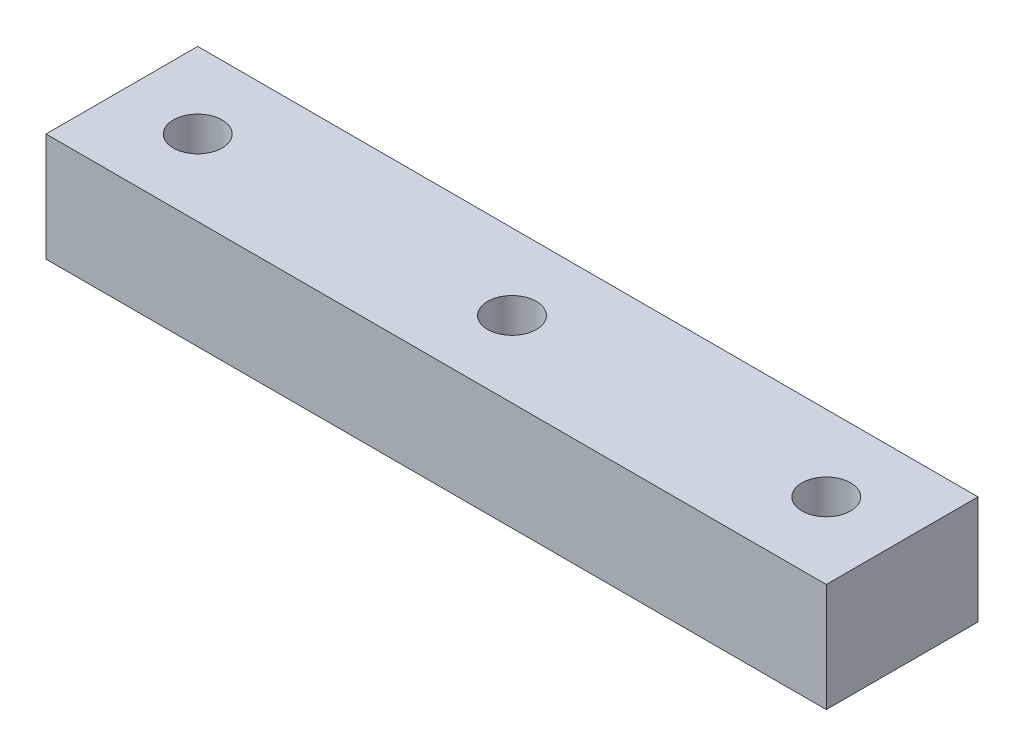
ISO-10303-21;
HEADER;
FILE_DESCRIPTION(('STEP AP214'),'2;1');
FILE_NAME('part.step','',(''),(''),'','','');
FILE_SCHEMA(('AUTOMOTIVE_DESIGN { 1 0 10303 214 1 1 1 1 }'));
ENDSEC;
DATA;
#1=APPLICATION_CONTEXT('core data for automotive mechanical design processes');
#2=APPLICATION_PROTOCOL_DEFINITION('international standard','automotive_design',2000,#1);
#3=PRODUCT_CONTEXT('',#1,'mechanical');
#4=PRODUCT('Part','Part','',(#3));
#5=PRODUCT_RELATED_PRODUCT_CATEGORY('part','',(#4));
#6=PRODUCT_DEFINITION_FORMATION('','',#4);
#7=PRODUCT_DEFINITION_CONTEXT('part definition',#1,'design');
#8=PRODUCT_DEFINITION('design','',#6,#7);
#9=PRODUCT_DEFINITION_SHAPE('','',#8);
#10=(LENGTH_UNIT() NAMED_UNIT(*) SI_UNIT(.MILLI.,.METRE.));
#11=(NAMED_UNIT(*) PLANE_ANGLE_UNIT() SI_UNIT($,.RADIAN.));
#12=(NAMED_UNIT(*) SI_UNIT($,.STERADIAN.) SOLID_ANGLE_UNIT());
#13=UNCERTAINTY_MEASURE_WITH_UNIT(LENGTH_MEASURE(1.E-05),#10,'distance_accuracy_value','');
#14=(GEOMETRIC_REPRESENTATION_CONTEXT(3) GLOBAL_UNCERTAINTY_ASSIGNED_CONTEXT((#13)) GLOBAL_UNIT_ASSIGNED_CONTEXT((#10,
#11,#12)) REPRESENTATION_CONTEXT('',''));
#15=CARTESIAN_POINT('',(0.,0.,0.));
#16=DIRECTION('',(0.,0.,1.));
#17=DIRECTION('',(1.,0.,0.));
#18=AXIS2_PLACEMENT_3D('',#15,#16,#17);
#19=CARTESIAN_POINT('',(0.,10.,0.));
#20=DIRECTION('',(0.,-1.,0.));
#21=DIRECTION('',(0.,0.,-1.));
#22=AXIS2_PLACEMENT_3D('',#19,#20,#21);
#23=PLANE('',#22);
#24=DIRECTION('',(0.,0.,-1.));
#25=VECTOR('',#24,1.);
#26=CARTESIAN_POINT('',(36.,10.,7.));
#27=LINE('',#26,#25);
#28=CARTESIAN_POINT('',(36.,10.,7.));
#29=VERTEX_POINT('',#28);
#30=CARTESIAN_POINT('',(36.,10.,-7.));
#31=VERTEX_POINT('',#30);
#32=EDGE_CURVE('E88',#29,#31,#27,.T.);
#33=ORIENTED_EDGE('',*,*,#32,.T.);
#34=DIRECTION('',(-1.,0.,0.));
#35=VECTOR('',#34,1.);
#36=CARTESIAN_POINT('',(-36.,10.,-7.));
#37=LINE('',#36,#35);
#38=CARTESIAN_POINT('',(-36.,10.,-7.));
#39=VERTEX_POINT('',#38);
#40=EDGE_CURVE('E83',#31,#39,#37,.T.);
#41=ORIENTED_EDGE('',*,*,#40,.T.);
#42=DIRECTION('',(0.,0.,1.));
#43=VECTOR('',#42,1.);
#44=CARTESIAN_POINT('',(-36.,10.,7.));
#45=LINE('',#44,#43);
#46=CARTESIAN_POINT('',(-36.,10.,7.));
#47=VERTEX_POINT('',#46);
#48=EDGE_CURVE('E86',#39,#47,#45,.T.);
#49=ORIENTED_EDGE('',*,*,#48,.T.);
#50=DIRECTION('',(1.,0.,0.));
#51=VECTOR('',#50,1.);
#52=CARTESIAN_POINT('',(-36.,10.,7.));
#53=LINE('',#52,#51);
#54=EDGE_CURVE('E53',#47,#29,#53,.T.);
#55=ORIENTED_EDGE('',*,*,#54,.T.);
#56=EDGE_LOOP('',(#33,#41,#49,#55));
#57=FACE_BOUND('',#56,.T.);
#58=CARTESIAN_POINT('',(0.,10.,0.));
#59=DIRECTION('',(0.,1.,0.));
#60=DIRECTION('',(0.,0.,1.));
#61=AXIS2_PLACEMENT_3D('',#58,#59,#60);
#62=CIRCLE('',#61,2.25);
#63=CARTESIAN_POINT('',(0.,10.,2.25));
#64=VERTEX_POINT('',#63);
#65=EDGE_CURVE('E103',#64,#64,#62,.T.);
#66=ORIENTED_EDGE('',*,*,#65,.F.);
#67=EDGE_LOOP('',(#66));
#68=FACE_BOUND('',#67,.T.);
#69=CARTESIAN_POINT('',(-29.,10.,0.));
#70=DIRECTION('',(0.,1.,0.));
#71=DIRECTION('',(0.,0.,1.));
#72=AXIS2_PLACEMENT_3D('',#69,#70,#71);
#73=CIRCLE('',#72,2.25);
#74=CARTESIAN_POINT('',(-29.,10.,2.25));
#75=VERTEX_POINT('',#74);
#76=EDGE_CURVE('E118',#75,#75,#73,.T.);
#77=ORIENTED_EDGE('',*,*,#76,.F.);
#78=EDGE_LOOP('',(#77));
#79=FACE_BOUND('',#78,.T.);
#80=CARTESIAN_POINT('',(29.,10.,0.));
#81=DIRECTION('',(0.,1.,0.));
#82=DIRECTION('',(0.,0.,1.));
#83=AXIS2_PLACEMENT_3D('',#80,#81,#82);
#84=CIRCLE('',#83,2.25);
#85=CARTESIAN_POINT('',(29.,10.,2.25000000000001));
#86=VERTEX_POINT('',#85);
#87=EDGE_CURVE('E124',#86,#86,#84,.T.);
#88=ORIENTED_EDGE('',*,*,#87,.F.);
#89=EDGE_LOOP('',(#88));
#90=FACE_BOUND('',#89,.T.);
#91=ADVANCED_FACE('F36',(#57,#68,#79,#90),#23,.F.);
#92=CARTESIAN_POINT('',(0.,0.,0.));
#93=DIRECTION('',(0.,-1.,0.));
#94=DIRECTION('',(0.,0.,-1.));
#95=AXIS2_PLACEMENT_3D('',#92,#93,#94);
#96=PLANE('',#95);
#97=CARTESIAN_POINT('',(-29.,0.,0.));
#98=DIRECTION('',(0.,1.,0.));
#99=DIRECTION('',(0.,0.,1.));
#100=AXIS2_PLACEMENT_3D('',#97,#98,#99);
#101=CIRCLE('',#100,2.25);
#102=CARTESIAN_POINT('',(-29.,0.,2.25));
#103=VERTEX_POINT('',#102);
#104=EDGE_CURVE('E121',#103,#103,#101,.T.);
#105=ORIENTED_EDGE('',*,*,#104,.T.);
#106=EDGE_LOOP('',(#105));
#107=FACE_BOUND('',#106,.T.);
#108=DIRECTION('',(0.,0.,-1.));
#109=VECTOR('',#108,1.);
#110=CARTESIAN_POINT('',(36.,0.,7.));
#111=LINE('',#110,#109);
#112=CARTESIAN_POINT('',(36.,0.,7.));
#113=VERTEX_POINT('',#112);
#114=CARTESIAN_POINT('',(36.,0.,-7.));
#115=VERTEX_POINT('',#114);
#116=EDGE_CURVE('E100',#113,#115,#111,.T.);
#117=ORIENTED_EDGE('',*,*,#116,.F.);
#118=DIRECTION('',(1.,0.,0.));
#119=VECTOR('',#118,1.);
#120=CARTESIAN_POINT('',(-36.,0.,7.));
#121=LINE('',#120,#119);
#122=CARTESIAN_POINT('',(-36.,0.,7.));
#123=VERTEX_POINT('',#122);
#124=EDGE_CURVE('E76',#123,#113,#121,.T.);
#125=ORIENTED_EDGE('',*,*,#124,.F.);
#126=DIRECTION('',(0.,0.,1.));
#127=VECTOR('',#126,1.);
#128=CARTESIAN_POINT('',(-36.,0.,7.));
#129=LINE('',#128,#127);
#130=CARTESIAN_POINT('',(-36.,0.,-7.));
#131=VERTEX_POINT('',#130);
#132=EDGE_CURVE('E70',#131,#123,#129,.T.);
#133=ORIENTED_EDGE('',*,*,#132,.F.);
#134=DIRECTION('',(-1.,0.,0.));
#135=VECTOR('',#134,1.);
#136=CARTESIAN_POINT('',(-36.,0.,-7.));
#137=LINE('',#136,#135);
#138=EDGE_CURVE('E92',#115,#131,#137,.T.);
#139=ORIENTED_EDGE('',*,*,#138,.F.);
#140=EDGE_LOOP('',(#117,#125,#133,#139));
#141=FACE_BOUND('',#140,.T.);
#142=CARTESIAN_POINT('',(0.,0.,0.));
#143=DIRECTION('',(0.,1.,0.));
#144=DIRECTION('',(0.,0.,1.));
#145=AXIS2_PLACEMENT_3D('',#142,#143,#144);
#146=CIRCLE('',#145,2.25);
#147=CARTESIAN_POINT('',(0.,0.,2.25));
#148=VERTEX_POINT('',#147);
#149=EDGE_CURVE('E115',#148,#148,#146,.T.);
#150=ORIENTED_EDGE('',*,*,#149,.T.);
#151=EDGE_LOOP('',(#150));
#152=FACE_BOUND('',#151,.T.);
#153=CARTESIAN_POINT('',(29.,0.,0.));
#154=DIRECTION('',(0.,1.,0.));
#155=DIRECTION('',(0.,0.,1.));
#156=AXIS2_PLACEMENT_3D('',#153,#154,#155);
#157=CIRCLE('',#156,2.25);
#158=CARTESIAN_POINT('',(29.,0.,2.25000000000001));
#159=VERTEX_POINT('',#158);
#160=EDGE_CURVE('E127',#159,#159,#157,.T.);
#161=ORIENTED_EDGE('',*,*,#160,.T.);
#162=EDGE_LOOP('',(#161));
#163=FACE_BOUND('',#162,.T.);
#164=ADVANCED_FACE('F111',(#107,#141,#152,#163),#96,.T.);
#165=CARTESIAN_POINT('',(36.,10.,7.));
#166=DIRECTION('',(-1.,0.,0.));
#167=DIRECTION('',(0.,0.,1.));
#168=AXIS2_PLACEMENT_3D('',#165,#166,#167);
#169=PLANE('',#168);
#170=ORIENTED_EDGE('',*,*,#116,.T.);
#171=DIRECTION('',(0.,-1.,0.));
#172=VECTOR('',#171,1.);
#173=CARTESIAN_POINT('',(36.,10.,-7.));
#174=LINE('',#173,#172);
#175=EDGE_CURVE('E11',#31,#115,#174,.T.);
#176=ORIENTED_EDGE('',*,*,#175,.F.);
#177=ORIENTED_EDGE('',*,*,#32,.F.);
#178=DIRECTION('',(0.,-1.,0.));
#179=VECTOR('',#178,1.);
#180=CARTESIAN_POINT('',(36.,10.,7.));
#181=LINE('',#180,#179);
#182=EDGE_CURVE('E96',#29,#113,#181,.T.);
#183=ORIENTED_EDGE('',*,*,#182,.T.);
#184=EDGE_LOOP('',(#170,#176,#177,#183));
#185=FACE_BOUND('',#184,.T.);
#186=ADVANCED_FACE('F38',(#185),#169,.F.);
#187=CARTESIAN_POINT('',(-36.,10.,-7.));
#188=DIRECTION('',(0.,0.,1.));
#189=DIRECTION('',(1.,0.,0.));
#190=AXIS2_PLACEMENT_3D('',#187,#188,#189);
#191=PLANE('',#190);
#192=ORIENTED_EDGE('',*,*,#138,.T.);
#193=DIRECTION('',(0.,-1.,0.));
#194=VECTOR('',#193,1.);
#195=CARTESIAN_POINT('',(-36.,10.,-7.));
#196=LINE('',#195,#194);
#197=EDGE_CURVE('E45',#39,#131,#196,.T.);
#198=ORIENTED_EDGE('',*,*,#197,.F.);
#199=ORIENTED_EDGE('',*,*,#40,.F.);
#200=ORIENTED_EDGE('',*,*,#175,.T.);
#201=EDGE_LOOP('',(#192,#198,#199,#200));
#202=FACE_BOUND('',#201,.T.);
#203=ADVANCED_FACE('F91',(#202),#191,.F.);
#204=CARTESIAN_POINT('',(-36.,10.,7.));
#205=DIRECTION('',(1.,0.,0.));
#206=DIRECTION('',(0.,0.,-1.));
#207=AXIS2_PLACEMENT_3D('',#204,#205,#206);
#208=PLANE('',#207);
#209=ORIENTED_EDGE('',*,*,#132,.T.);
#210=DIRECTION('',(0.,-1.,0.));
#211=VECTOR('',#210,1.);
#212=CARTESIAN_POINT('',(-36.,10.,7.));
#213=LINE('',#212,#211);
#214=EDGE_CURVE('E93',#47,#123,#213,.T.);
#215=ORIENTED_EDGE('',*,*,#214,.F.);
#216=ORIENTED_EDGE('',*,*,#48,.F.);
#217=ORIENTED_EDGE('',*,*,#197,.T.);
#218=EDGE_LOOP('',(#209,#215,#216,#217));
#219=FACE_BOUND('',#218,.T.);
#220=ADVANCED_FACE('F94',(#219),#208,.F.);
#221=CARTESIAN_POINT('',(-36.,10.,7.));
#222=DIRECTION('',(0.,0.,-1.));
#223=DIRECTION('',(-1.,0.,0.));
#224=AXIS2_PLACEMENT_3D('',#221,#222,#223);
#225=PLANE('',#224);
#226=ORIENTED_EDGE('',*,*,#124,.T.);
#227=ORIENTED_EDGE('',*,*,#182,.F.);
#228=ORIENTED_EDGE('',*,*,#54,.F.);
#229=ORIENTED_EDGE('',*,*,#214,.T.);
#230=EDGE_LOOP('',(#226,#227,#228,#229));
#231=FACE_BOUND('',#230,.T.);
#232=ADVANCED_FACE('F108',(#231),#225,.F.);
#233=CARTESIAN_POINT('',(0.,10.,0.));
#234=DIRECTION('',(0.,-1.,0.));
#235=DIRECTION('',(0.,0.,-1.));
#236=AXIS2_PLACEMENT_3D('',#233,#234,#235);
#237=CYLINDRICAL_SURFACE('',#236,2.25);
#238=ORIENTED_EDGE('',*,*,#65,.T.);
#239=EDGE_LOOP('',(#238));
#240=FACE_BOUND('',#239,.T.);
#241=ORIENTED_EDGE('',*,*,#149,.F.);
#242=EDGE_LOOP('',(#241));
#243=FACE_BOUND('',#242,.T.);
#244=ADVANCED_FACE('F144',(#240,#243),#237,.F.);
#245=CARTESIAN_POINT('',(-29.,10.,0.));
#246=DIRECTION('',(0.,-1.,0.));
#247=DIRECTION('',(0.,0.,-1.));
#248=AXIS2_PLACEMENT_3D('',#245,#246,#247);
#249=CYLINDRICAL_SURFACE('',#248,2.25);
#250=ORIENTED_EDGE('',*,*,#76,.T.);
#251=EDGE_LOOP('',(#250));
#252=FACE_BOUND('',#251,.T.);
#253=ORIENTED_EDGE('',*,*,#104,.F.);
#254=EDGE_LOOP('',(#253));
#255=FACE_BOUND('',#254,.T.);
#256=ADVANCED_FACE('F190',(#252,#255),#249,.F.);
#257=CARTESIAN_POINT('',(29.,10.,0.));
#258=DIRECTION('',(0.,-1.,0.));
#259=DIRECTION('',(0.,0.,-1.));
#260=AXIS2_PLACEMENT_3D('',#257,#258,#259);
#261=CYLINDRICAL_SURFACE('',#260,2.25);
#262=ORIENTED_EDGE('',*,*,#87,.T.);
#263=EDGE_LOOP('',(#262));
#264=FACE_BOUND('',#263,.T.);
#265=ORIENTED_EDGE('',*,*,#160,.F.);
#266=EDGE_LOOP('',(#265));
#267=FACE_BOUND('',#266,.T.);
#268=ADVANCED_FACE('F133',(#264,#267),#261,.F.);
#269=CLOSED_SHELL('',(#91,#164,#186,#203,#220,#232,#244,#256,#268));
#270=MANIFOLD_SOLID_BREP('B2',#269);
#271=ADVANCED_BREP_SHAPE_REPRESENTATION('',(#18,#270),#14);
#272=SHAPE_DEFINITION_REPRESENTATION(#9,#271);
ENDSEC;
END-ISO-10303-21;
